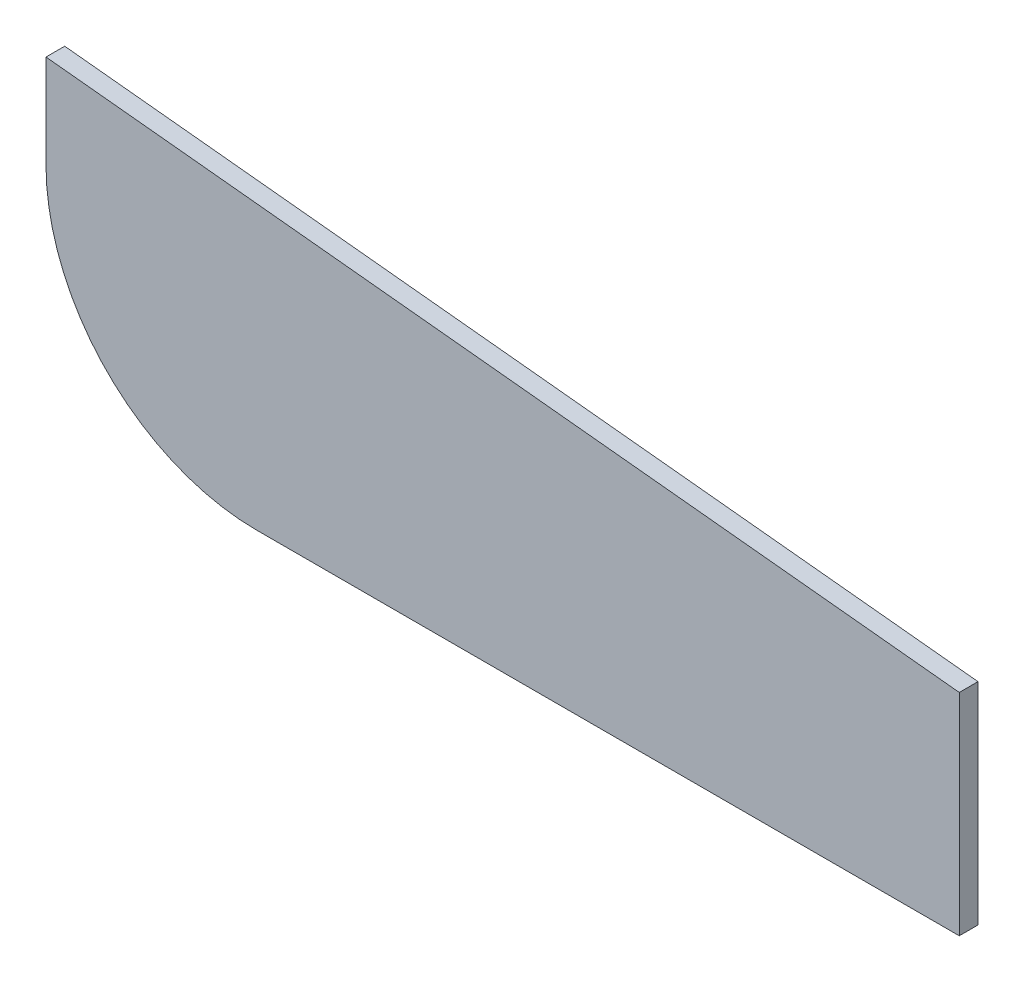
ISO-10303-21;
HEADER;
FILE_DESCRIPTION(('STEP AP214'),'2;1');
FILE_NAME('part.step','',(''),(''),'','','');
FILE_SCHEMA(('AUTOMOTIVE_DESIGN { 1 0 10303 214 1 1 1 1 }'));
ENDSEC;
DATA;
#1=APPLICATION_CONTEXT('core data for automotive mechanical design processes');
#2=APPLICATION_PROTOCOL_DEFINITION('international standard','automotive_design',2000,#1);
#3=PRODUCT_CONTEXT('',#1,'mechanical');
#4=PRODUCT('Part','Part','',(#3));
#5=PRODUCT_RELATED_PRODUCT_CATEGORY('part','',(#4));
#6=PRODUCT_DEFINITION_FORMATION('','',#4);
#7=PRODUCT_DEFINITION_CONTEXT('part definition',#1,'design');
#8=PRODUCT_DEFINITION('design','',#6,#7);
#9=PRODUCT_DEFINITION_SHAPE('','',#8);
#10=(LENGTH_UNIT() NAMED_UNIT(*) SI_UNIT(.MILLI.,.METRE.));
#11=(NAMED_UNIT(*) PLANE_ANGLE_UNIT() SI_UNIT($,.RADIAN.));
#12=(NAMED_UNIT(*) SI_UNIT($,.STERADIAN.) SOLID_ANGLE_UNIT());
#13=UNCERTAINTY_MEASURE_WITH_UNIT(LENGTH_MEASURE(1.E-05),#10,'distance_accuracy_value','');
#14=(GEOMETRIC_REPRESENTATION_CONTEXT(3) GLOBAL_UNCERTAINTY_ASSIGNED_CONTEXT((#13)) GLOBAL_UNIT_ASSIGNED_CONTEXT((#10,
#11,#12)) REPRESENTATION_CONTEXT('',''));
#15=CARTESIAN_POINT('',(0.,0.,0.));
#16=DIRECTION('',(0.,0.,1.));
#17=DIRECTION('',(1.,0.,0.));
#18=AXIS2_PLACEMENT_3D('',#15,#16,#17);
#19=CARTESIAN_POINT('',(0.,-65.,0.));
#20=DIRECTION('',(0.,-1.,0.));
#21=DIRECTION('',(0.,0.,-1.));
#22=AXIS2_PLACEMENT_3D('',#19,#20,#21);
#23=PLANE('',#22);
#24=DIRECTION('',(1.,0.,0.));
#25=VECTOR('',#24,1.);
#26=CARTESIAN_POINT('',(-97.5,-65.,2.));
#27=LINE('',#26,#25);
#28=CARTESIAN_POINT('',(-52.5,-65.,2.));
#29=VERTEX_POINT('',#28);
#30=CARTESIAN_POINT('',(97.5,-65.,2.));
#31=VERTEX_POINT('',#30);
#32=EDGE_CURVE('E56',#29,#31,#27,.T.);
#33=ORIENTED_EDGE('',*,*,#32,.F.);
#34=DIRECTION('',(0.,0.,1.));
#35=VECTOR('',#34,1.);
#36=CARTESIAN_POINT('',(-52.5,-65.,-8.));
#37=LINE('',#36,#35);
#38=CARTESIAN_POINT('',(-52.5,-65.,-2.));
#39=VERTEX_POINT('',#38);
#40=EDGE_CURVE('E11',#29,#39,#37,.F.);
#41=ORIENTED_EDGE('',*,*,#40,.T.);
#42=DIRECTION('',(-1.,0.,0.));
#43=VECTOR('',#42,1.);
#44=CARTESIAN_POINT('',(-97.5,-65.,-2.));
#45=LINE('',#44,#43);
#46=CARTESIAN_POINT('',(97.5,-65.,-2.));
#47=VERTEX_POINT('',#46);
#48=EDGE_CURVE('E109',#47,#39,#45,.T.);
#49=ORIENTED_EDGE('',*,*,#48,.F.);
#50=DIRECTION('',(0.,0.,-1.));
#51=VECTOR('',#50,1.);
#52=CARTESIAN_POINT('',(97.5,-65.,2.));
#53=LINE('',#52,#51);
#54=EDGE_CURVE('E112',#31,#47,#53,.T.);
#55=ORIENTED_EDGE('',*,*,#54,.F.);
#56=EDGE_LOOP('',(#33,#41,#49,#55));
#57=FACE_BOUND('',#56,.T.);
#58=ADVANCED_FACE('F33',(#57),#23,.T.);
#59=CARTESIAN_POINT('',(97.5,-65.,2.));
#60=DIRECTION('',(1.,0.,0.));
#61=DIRECTION('',(0.,0.,-1.));
#62=AXIS2_PLACEMENT_3D('',#59,#60,#61);
#63=PLANE('',#62);
#64=DIRECTION('',(0.,0.,1.));
#65=VECTOR('',#64,1.);
#66=CARTESIAN_POINT('',(97.5,-20.,-8.));
#67=LINE('',#66,#65);
#68=CARTESIAN_POINT('',(97.5,-20.,-2.));
#69=VERTEX_POINT('',#68);
#70=CARTESIAN_POINT('',(97.5,-20.,2.));
#71=VERTEX_POINT('',#70);
#72=EDGE_CURVE('E74',#69,#71,#67,.T.);
#73=ORIENTED_EDGE('',*,*,#72,.T.);
#74=DIRECTION('',(0.,1.,0.));
#75=VECTOR('',#74,1.);
#76=CARTESIAN_POINT('',(97.5,-65.,2.));
#77=LINE('',#76,#75);
#78=EDGE_CURVE('E41',#31,#71,#77,.T.);
#79=ORIENTED_EDGE('',*,*,#78,.F.);
#80=ORIENTED_EDGE('',*,*,#54,.T.);
#81=DIRECTION('',(0.,1.,0.));
#82=VECTOR('',#81,1.);
#83=CARTESIAN_POINT('',(97.5,-65.,-2.));
#84=LINE('',#83,#82);
#85=EDGE_CURVE('E103',#47,#69,#84,.T.);
#86=ORIENTED_EDGE('',*,*,#85,.T.);
#87=EDGE_LOOP('',(#73,#79,#80,#86));
#88=FACE_BOUND('',#87,.T.);
#89=ADVANCED_FACE('F35',(#88),#63,.T.);
#90=CARTESIAN_POINT('',(-97.5,-65.,2.));
#91=DIRECTION('',(0.,0.,1.));
#92=DIRECTION('',(1.,0.,0.));
#93=AXIS2_PLACEMENT_3D('',#90,#91,#92);
#94=PLANE('',#93);
#95=CARTESIAN_POINT('',(-52.5,-20.,2.));
#96=DIRECTION('',(0.,0.,-1.));
#97=DIRECTION('',(1.,0.,0.));
#98=AXIS2_PLACEMENT_3D('',#95,#96,#97);
#99=CIRCLE('',#98,45.);
#100=CARTESIAN_POINT('',(-97.5,-20.,2.));
#101=VERTEX_POINT('',#100);
#102=EDGE_CURVE('E86',#29,#101,#99,.T.);
#103=ORIENTED_EDGE('',*,*,#102,.F.);
#104=ORIENTED_EDGE('',*,*,#32,.T.);
#105=ORIENTED_EDGE('',*,*,#78,.T.);
#106=DIRECTION('',(0.994781438611052,-0.102028865498569,0.));
#107=VECTOR('',#106,1.);
#108=CARTESIAN_POINT('',(-97.5,0.,2.));
#109=LINE('',#108,#107);
#110=CARTESIAN_POINT('',(-97.5,0.,2.));
#111=VERTEX_POINT('',#110);
#112=EDGE_CURVE('E100',#111,#71,#109,.T.);
#113=ORIENTED_EDGE('',*,*,#112,.F.);
#114=DIRECTION('',(0.,1.,0.));
#115=VECTOR('',#114,1.);
#116=CARTESIAN_POINT('',(-97.5,-65.,2.));
#117=LINE('',#116,#115);
#118=EDGE_CURVE('E95',#101,#111,#117,.T.);
#119=ORIENTED_EDGE('',*,*,#118,.F.);
#120=EDGE_LOOP('',(#103,#104,#105,#113,#119));
#121=FACE_BOUND('',#120,.T.);
#122=ADVANCED_FACE('F99',(#121),#94,.T.);
#123=CARTESIAN_POINT('',(-97.5,-65.,2.));
#124=DIRECTION('',(-1.,0.,0.));
#125=DIRECTION('',(0.,0.,1.));
#126=AXIS2_PLACEMENT_3D('',#123,#124,#125);
#127=PLANE('',#126);
#128=DIRECTION('',(0.,0.,1.));
#129=VECTOR('',#128,1.);
#130=CARTESIAN_POINT('',(-97.5,-20.,-8.));
#131=LINE('',#130,#129);
#132=CARTESIAN_POINT('',(-97.5,-20.,-2.));
#133=VERTEX_POINT('',#132);
#134=EDGE_CURVE('E89',#133,#101,#131,.T.);
#135=ORIENTED_EDGE('',*,*,#134,.T.);
#136=ORIENTED_EDGE('',*,*,#118,.T.);
#137=DIRECTION('',(0.,0.,1.));
#138=VECTOR('',#137,1.);
#139=CARTESIAN_POINT('',(-97.5,0.,2.));
#140=LINE('',#139,#138);
#141=CARTESIAN_POINT('',(-97.5,0.,-2.));
#142=VERTEX_POINT('',#141);
#143=EDGE_CURVE('E115',#142,#111,#140,.T.);
#144=ORIENTED_EDGE('',*,*,#143,.F.);
#145=DIRECTION('',(0.,1.,0.));
#146=VECTOR('',#145,1.);
#147=CARTESIAN_POINT('',(-97.5,-65.,-2.));
#148=LINE('',#147,#146);
#149=EDGE_CURVE('E67',#133,#142,#148,.T.);
#150=ORIENTED_EDGE('',*,*,#149,.F.);
#151=EDGE_LOOP('',(#135,#136,#144,#150));
#152=FACE_BOUND('',#151,.T.);
#153=ADVANCED_FACE('F93',(#152),#127,.T.);
#154=CARTESIAN_POINT('',(-97.5,-65.,-2.));
#155=DIRECTION('',(0.,0.,-1.));
#156=DIRECTION('',(-1.,0.,0.));
#157=AXIS2_PLACEMENT_3D('',#154,#155,#156);
#158=PLANE('',#157);
#159=CARTESIAN_POINT('',(-52.5,-20.,-2.));
#160=DIRECTION('',(0.,0.,-1.));
#161=DIRECTION('',(-1.,0.,0.));
#162=AXIS2_PLACEMENT_3D('',#159,#160,#161);
#163=CIRCLE('',#162,45.);
#164=EDGE_CURVE('E48',#133,#39,#163,.F.);
#165=ORIENTED_EDGE('',*,*,#164,.F.);
#166=ORIENTED_EDGE('',*,*,#149,.T.);
#167=DIRECTION('',(-0.994781438611053,0.10202886549857,0.));
#168=VECTOR('',#167,1.);
#169=CARTESIAN_POINT('',(-90.9027325959662,-0.676642810670133,-2.));
#170=LINE('',#169,#168);
#171=EDGE_CURVE('E116',#69,#142,#170,.T.);
#172=ORIENTED_EDGE('',*,*,#171,.F.);
#173=ORIENTED_EDGE('',*,*,#85,.F.);
#174=ORIENTED_EDGE('',*,*,#48,.T.);
#175=EDGE_LOOP('',(#165,#166,#172,#173,#174));
#176=FACE_BOUND('',#175,.T.);
#177=ADVANCED_FACE('F125',(#176),#158,.T.);
#178=CARTESIAN_POINT('',(-97.5,0.,-8.));
#179=DIRECTION('',(-0.102028865498569,-0.994781438611052,0.));
#180=DIRECTION('',(0.994781438611053,-0.10202886549857,0.));
#181=AXIS2_PLACEMENT_3D('',#178,#179,#180);
#182=PLANE('',#181);
#183=ORIENTED_EDGE('',*,*,#171,.T.);
#184=ORIENTED_EDGE('',*,*,#143,.T.);
#185=ORIENTED_EDGE('',*,*,#112,.T.);
#186=ORIENTED_EDGE('',*,*,#72,.F.);
#187=EDGE_LOOP('',(#183,#184,#185,#186));
#188=FACE_BOUND('',#187,.T.);
#189=ADVANCED_FACE('F121',(#188),#182,.F.);
#190=CARTESIAN_POINT('',(-52.5,-20.,-8.));
#191=DIRECTION('',(0.,0.,1.));
#192=DIRECTION('',(1.,0.,0.));
#193=AXIS2_PLACEMENT_3D('',#190,#191,#192);
#194=CYLINDRICAL_SURFACE('',#193,45.);
#195=ORIENTED_EDGE('',*,*,#164,.T.);
#196=ORIENTED_EDGE('',*,*,#40,.F.);
#197=ORIENTED_EDGE('',*,*,#102,.T.);
#198=ORIENTED_EDGE('',*,*,#134,.F.);
#199=EDGE_LOOP('',(#195,#196,#197,#198));
#200=FACE_BOUND('',#199,.T.);
#201=ADVANCED_FACE('F88',(#200),#194,.T.);
#202=CLOSED_SHELL('',(#58,#89,#122,#153,#177,#189,#201));
#203=MANIFOLD_SOLID_BREP('B2',#202);
#204=ADVANCED_BREP_SHAPE_REPRESENTATION('',(#18,#203),#14);
#205=SHAPE_DEFINITION_REPRESENTATION(#9,#204);
ENDSEC;
END-ISO-10303-21;
